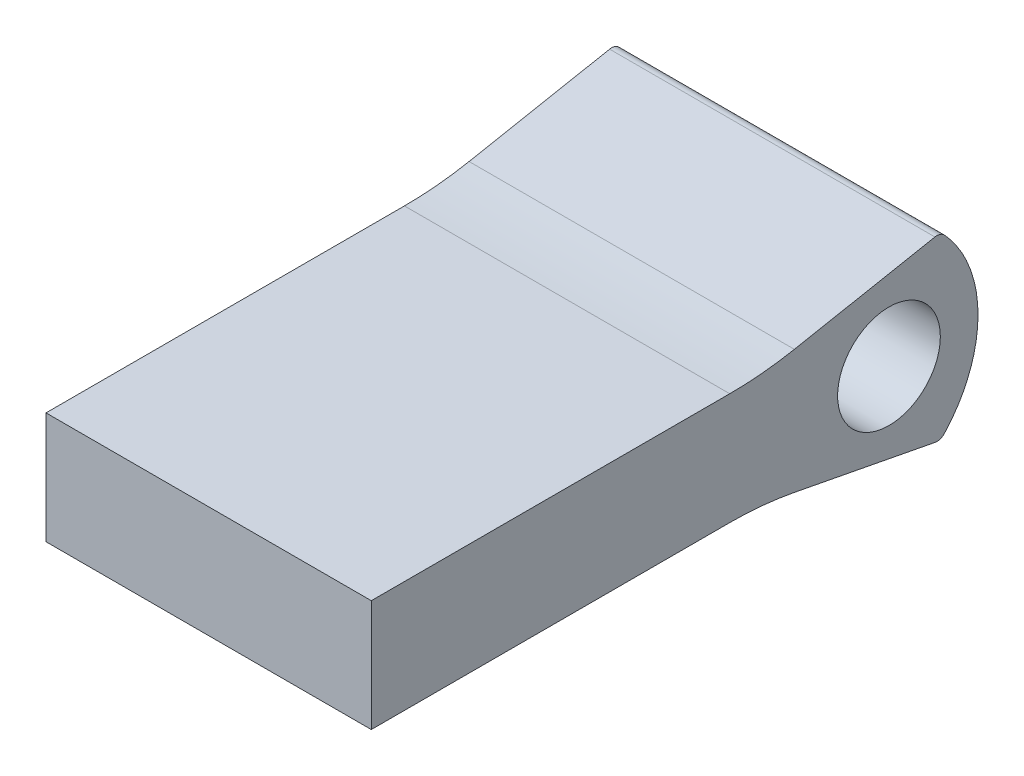
ISO-10303-21;
HEADER;
FILE_DESCRIPTION(('STEP AP214'),'2;1');
FILE_NAME('part.step','',(''),(''),'','','');
FILE_SCHEMA(('AUTOMOTIVE_DESIGN { 1 0 10303 214 1 1 1 1 }'));
ENDSEC;
DATA;
#1=APPLICATION_CONTEXT('core data for automotive mechanical design processes');
#2=APPLICATION_PROTOCOL_DEFINITION('international standard','automotive_design',2000,#1);
#3=PRODUCT_CONTEXT('',#1,'mechanical');
#4=PRODUCT('Part','Part','',(#3));
#5=PRODUCT_RELATED_PRODUCT_CATEGORY('part','',(#4));
#6=PRODUCT_DEFINITION_FORMATION('','',#4);
#7=PRODUCT_DEFINITION_CONTEXT('part definition',#1,'design');
#8=PRODUCT_DEFINITION('design','',#6,#7);
#9=PRODUCT_DEFINITION_SHAPE('','',#8);
#10=(LENGTH_UNIT() NAMED_UNIT(*) SI_UNIT(.MILLI.,.METRE.));
#11=(NAMED_UNIT(*) PLANE_ANGLE_UNIT() SI_UNIT($,.RADIAN.));
#12=(NAMED_UNIT(*) SI_UNIT($,.STERADIAN.) SOLID_ANGLE_UNIT());
#13=UNCERTAINTY_MEASURE_WITH_UNIT(LENGTH_MEASURE(1.E-05),#10,'distance_accuracy_value','');
#14=(GEOMETRIC_REPRESENTATION_CONTEXT(3) GLOBAL_UNCERTAINTY_ASSIGNED_CONTEXT((#13)) GLOBAL_UNIT_ASSIGNED_CONTEXT((#10,
#11,#12)) REPRESENTATION_CONTEXT('',''));
#15=CARTESIAN_POINT('',(0.,0.,0.));
#16=DIRECTION('',(0.,0.,1.));
#17=DIRECTION('',(1.,0.,0.));
#18=AXIS2_PLACEMENT_3D('',#15,#16,#17);
#19=CARTESIAN_POINT('',(-4.75,-1.63,11.42));
#20=DIRECTION('',(1.,0.,0.));
#21=DIRECTION('',(0.,0.,-1.));
#22=AXIS2_PLACEMENT_3D('',#19,#20,#21);
#23=PLANE('',#22);
#24=CARTESIAN_POINT('',(-4.75,0.,-3.69821614915546));
#25=DIRECTION('',(1.,0.,0.));
#26=DIRECTION('',(0.,0.,-1.));
#27=AXIS2_PLACEMENT_3D('',#24,#25,#26);
#28=CIRCLE('',#27,1.5);
#29=CARTESIAN_POINT('',(-4.75,0.,-5.19821614915546));
#30=VERTEX_POINT('',#29);
#31=EDGE_CURVE('E286',#30,#30,#28,.T.);
#32=ORIENTED_EDGE('',*,*,#31,.T.);
#33=EDGE_LOOP('',(#32));
#34=FACE_BOUND('',#33,.T.);
#35=DIRECTION('',(0.,-0.188694042746231,0.982035925122948));
#36=VECTOR('',#35,1.);
#37=CARTESIAN_POINT('',(-4.75,1.5719631299183,0.302046055998579));
#38=LINE('',#37,#36);
#39=CARTESIAN_POINT('',(-4.75,2.59853933788299,-5.04064893015751));
#40=VERTEX_POINT('',#39);
#41=CARTESIAN_POINT('',(-4.75,1.80964074877052,-0.934919122729769));
#42=VERTEX_POINT('',#41);
#43=EDGE_CURVE('E218',#40,#42,#38,.T.);
#44=ORIENTED_EDGE('',*,*,#43,.F.);
#45=CARTESIAN_POINT('',(-4.75,2.3039285603461,-5.09725714298138));
#46=DIRECTION('',(1.,0.,0.));
#47=DIRECTION('',(0.,0.,-1.));
#48=AXIS2_PLACEMENT_3D('',#45,#46,#47);
#49=CIRCLE('',#48,0.3);
#50=CARTESIAN_POINT('',(-4.75,2.5074591827078,-5.31765515967177));
#51=VERTEX_POINT('',#50);
#52=EDGE_CURVE('E176',#40,#51,#49,.F.);
#53=ORIENTED_EDGE('',*,*,#52,.T.);
#54=CARTESIAN_POINT('',(-4.75,-2.62915797088336,-5.2));
#55=CARTESIAN_POINT('',(-4.75,-2.54709102280826,-5.28305208589986));
#56=CARTESIAN_POINT('',(-4.75,-2.45949738312576,-5.36384463459304));
#57=CARTESIAN_POINT('',(-4.75,-2.16436994367198,-5.60978901008948));
#58=CARTESIAN_POINT('',(-4.75,-1.93621131721364,-5.76304208350538));
#59=CARTESIAN_POINT('',(-4.75,-1.43605067362415,-6.01942668348171));
#60=CARTESIAN_POINT('',(-4.75,-1.16408220535042,-6.12235313771278));
#61=CARTESIAN_POINT('',(-4.75,-0.594664263314326,-6.26182489781486));
#62=CARTESIAN_POINT('',(-4.75,-0.297392435895389,-6.29821630623773));
#63=CARTESIAN_POINT('',(-4.75,0.297396340524771,-6.29821599207218));
#64=CARTESIAN_POINT('',(-4.75,0.594668129499886,-6.26182426961327));
#65=CARTESIAN_POINT('',(-4.75,1.16408592419857,-6.12235190798175));
#66=CARTESIAN_POINT('',(-4.75,1.4360542837413,-6.01942516644496));
#67=CARTESIAN_POINT('',(-4.75,1.93621465648745,-5.7630400381023));
#68=CARTESIAN_POINT('',(-4.75,2.1643731210501,-5.60978672366112));
#69=CARTESIAN_POINT('',(-4.75,2.45949926240946,-5.3638429016465));
#70=CARTESIAN_POINT('',(-4.75,2.54709190215545,-5.28305119641047));
#71=CARTESIAN_POINT('',(-4.75,2.62915797088336,-5.2));
#72=B_SPLINE_CURVE_WITH_KNOTS('',3,(#54,#55,#56,#57,#58,#59,#60,#61,#62,#63,#64,#65,#66,#67,#68,
#69,#70,#71),.UNSPECIFIED.,.F.,.F.,(4,2,2,2,2,2,2,2,4),(0.163498387617703,0.204239042081437,
0.292588570034293,0.380938097987149,0.469287625940006,0.557637153892862,0.645986681845718,
0.734336209798575,0.775076410113093),.UNSPECIFIED.);
#73=CARTESIAN_POINT('',(-4.75,-2.50745918260675,-5.31765515940944));
#74=VERTEX_POINT('',#73);
#75=EDGE_CURVE('E146',#51,#74,#72,.F.);
#76=ORIENTED_EDGE('',*,*,#75,.T.);
#77=CARTESIAN_POINT('',(-4.75,-2.30392856028807,-5.09725714267932));
#78=DIRECTION('',(1.,0.,0.));
#79=DIRECTION('',(0.,0.,-1.));
#80=AXIS2_PLACEMENT_3D('',#77,#78,#79);
#81=CIRCLE('',#80,0.3);
#82=CARTESIAN_POINT('',(-4.75,-2.59853933782495,-5.04064892985546));
#83=VERTEX_POINT('',#82);
#84=EDGE_CURVE('E173',#74,#83,#81,.F.);
#85=ORIENTED_EDGE('',*,*,#84,.T.);
#86=DIRECTION('',(0.,0.188694042746231,0.982035925122948));
#87=VECTOR('',#86,1.);
#88=CARTESIAN_POINT('',(-4.75,-1.5719631299183,0.302046055998579));
#89=LINE('',#88,#87);
#90=CARTESIAN_POINT('',(-4.75,-1.80964074877053,-0.93491912272978));
#91=VERTEX_POINT('',#90);
#92=EDGE_CURVE('E224',#83,#91,#89,.T.);
#93=ORIENTED_EDGE('',*,*,#92,.T.);
#94=CARTESIAN_POINT('',(-4.75,-11.63,0.952021304732535));
#95=DIRECTION('',(1.,0.,0.));
#96=DIRECTION('',(0.,0.,-1.));
#97=AXIS2_PLACEMENT_3D('',#94,#95,#96);
#98=CIRCLE('',#97,10.);
#99=CARTESIAN_POINT('',(-4.75,-1.63,0.952021304732535));
#100=VERTEX_POINT('',#99);
#101=EDGE_CURVE('E11',#91,#100,#98,.T.);
#102=ORIENTED_EDGE('',*,*,#101,.T.);
#103=DIRECTION('',(0.,0.,-1.));
#104=VECTOR('',#103,1.);
#105=CARTESIAN_POINT('',(-4.75,-1.63,11.42));
#106=LINE('',#105,#104);
#107=CARTESIAN_POINT('',(-4.75,-1.63,11.42));
#108=VERTEX_POINT('',#107);
#109=EDGE_CURVE('E129',#108,#100,#106,.T.);
#110=ORIENTED_EDGE('',*,*,#109,.F.);
#111=DIRECTION('',(0.,-1.,0.));
#112=VECTOR('',#111,1.);
#113=CARTESIAN_POINT('',(-4.75,-1.63,11.42));
#114=LINE('',#113,#112);
#115=CARTESIAN_POINT('',(-4.75,1.63,11.42));
#116=VERTEX_POINT('',#115);
#117=EDGE_CURVE('E136',#116,#108,#114,.T.);
#118=ORIENTED_EDGE('',*,*,#117,.F.);
#119=DIRECTION('',(0.,0.,-1.));
#120=VECTOR('',#119,1.);
#121=CARTESIAN_POINT('',(-4.75,1.63,11.42));
#122=LINE('',#121,#120);
#123=CARTESIAN_POINT('',(-4.75,1.63,0.952021304732544));
#124=VERTEX_POINT('',#123);
#125=EDGE_CURVE('E215',#116,#124,#122,.T.);
#126=ORIENTED_EDGE('',*,*,#125,.T.);
#127=CARTESIAN_POINT('',(-4.75,11.63,0.952021304732544));
#128=DIRECTION('',(1.,0.,0.));
#129=DIRECTION('',(0.,0.,-1.));
#130=AXIS2_PLACEMENT_3D('',#127,#128,#129);
#131=CIRCLE('',#130,10.);
#132=EDGE_CURVE('E195',#124,#42,#131,.T.);
#133=ORIENTED_EDGE('',*,*,#132,.T.);
#134=EDGE_LOOP('',(#44,#53,#76,#85,#93,#102,#110,#118,#126,#133));
#135=FACE_BOUND('',#134,.T.);
#136=ADVANCED_FACE('F46',(#34,#135),#23,.F.);
#137=CARTESIAN_POINT('',(4.75,-1.63,11.42));
#138=DIRECTION('',(0.,1.,0.));
#139=DIRECTION('',(-1.,0.,0.));
#140=AXIS2_PLACEMENT_3D('',#137,#138,#139);
#141=PLANE('',#140);
#142=ORIENTED_EDGE('',*,*,#109,.T.);
#143=DIRECTION('',(1.,0.,0.));
#144=VECTOR('',#143,1.);
#145=CARTESIAN_POINT('',(4.75000000000001,-1.63,0.95202130473254));
#146=LINE('',#145,#144);
#147=CARTESIAN_POINT('',(4.75,-1.63,0.95202130473254));
#148=VERTEX_POINT('',#147);
#149=EDGE_CURVE('E190',#100,#148,#146,.T.);
#150=ORIENTED_EDGE('',*,*,#149,.T.);
#151=DIRECTION('',(0.,0.,-1.));
#152=VECTOR('',#151,1.);
#153=CARTESIAN_POINT('',(4.75,-1.63,11.42));
#154=LINE('',#153,#152);
#155=CARTESIAN_POINT('',(4.75,-1.63,11.42));
#156=VERTEX_POINT('',#155);
#157=EDGE_CURVE('E131',#156,#148,#154,.T.);
#158=ORIENTED_EDGE('',*,*,#157,.F.);
#159=DIRECTION('',(1.,0.,0.));
#160=VECTOR('',#159,1.);
#161=CARTESIAN_POINT('',(4.75,-1.63,11.42));
#162=LINE('',#161,#160);
#163=EDGE_CURVE('E124',#108,#156,#162,.T.);
#164=ORIENTED_EDGE('',*,*,#163,.F.);
#165=EDGE_LOOP('',(#142,#150,#158,#164));
#166=FACE_BOUND('',#165,.T.);
#167=ADVANCED_FACE('F126',(#166),#141,.F.);
#168=CARTESIAN_POINT('',(4.75,-1.63,11.42));
#169=DIRECTION('',(-1.,0.,0.));
#170=DIRECTION('',(0.,0.,1.));
#171=AXIS2_PLACEMENT_3D('',#168,#169,#170);
#172=PLANE('',#171);
#173=CARTESIAN_POINT('',(4.75,0.,-3.69821614915546));
#174=DIRECTION('',(1.,0.,0.));
#175=DIRECTION('',(0.,0.,-1.));
#176=AXIS2_PLACEMENT_3D('',#173,#174,#175);
#177=CIRCLE('',#176,1.5);
#178=CARTESIAN_POINT('',(4.75,0.,-5.19821614915546));
#179=VERTEX_POINT('',#178);
#180=EDGE_CURVE('E289',#179,#179,#177,.T.);
#181=ORIENTED_EDGE('',*,*,#180,.F.);
#182=EDGE_LOOP('',(#181));
#183=FACE_BOUND('',#182,.T.);
#184=CARTESIAN_POINT('',(4.75,-2.62915797088336,-5.2));
#185=CARTESIAN_POINT('',(4.75,-2.54709102280826,-5.28305208589986));
#186=CARTESIAN_POINT('',(4.75,-2.45949738312576,-5.36384463459304));
#187=CARTESIAN_POINT('',(4.75,-2.16436994367198,-5.60978901008948));
#188=CARTESIAN_POINT('',(4.75,-1.93621131721364,-5.76304208350538));
#189=CARTESIAN_POINT('',(4.75,-1.43605067362415,-6.01942668348171));
#190=CARTESIAN_POINT('',(4.75,-1.16408220535042,-6.12235313771278));
#191=CARTESIAN_POINT('',(4.75,-0.594664263314326,-6.26182489781486));
#192=CARTESIAN_POINT('',(4.75,-0.297392435895389,-6.29821630623773));
#193=CARTESIAN_POINT('',(4.75,0.297396340524771,-6.29821599207218));
#194=CARTESIAN_POINT('',(4.75,0.594668129499886,-6.26182426961327));
#195=CARTESIAN_POINT('',(4.75,1.16408592419857,-6.12235190798175));
#196=CARTESIAN_POINT('',(4.75,1.4360542837413,-6.01942516644496));
#197=CARTESIAN_POINT('',(4.75,1.93621465648745,-5.7630400381023));
#198=CARTESIAN_POINT('',(4.75,2.1643731210501,-5.60978672366112));
#199=CARTESIAN_POINT('',(4.75,2.45949926240946,-5.3638429016465));
#200=CARTESIAN_POINT('',(4.75,2.54709190215545,-5.28305119641047));
#201=CARTESIAN_POINT('',(4.75,2.62915797088336,-5.2));
#202=B_SPLINE_CURVE_WITH_KNOTS('',3,(#184,#185,#186,#187,#188,#189,#190,#191,#192,#193,#194,
#195,#196,#197,#198,#199,#200,#201),.UNSPECIFIED.,.F.,.F.,(4,2,2,2,2,2,2,2,4),
(0.163498387617703,0.204239042081437,0.292588570034293,0.380938097987149,0.469287625940006,
0.557637153892862,0.645986681845718,0.734336209798575,0.775076410113093),.UNSPECIFIED.);
#203=CARTESIAN_POINT('',(4.75,2.5074591827078,-5.31765515967177));
#204=VERTEX_POINT('',#203);
#205=CARTESIAN_POINT('',(4.75,-2.50745918260675,-5.31765515940944));
#206=VERTEX_POINT('',#205);
#207=EDGE_CURVE('E230',#204,#206,#202,.F.);
#208=ORIENTED_EDGE('',*,*,#207,.F.);
#209=CARTESIAN_POINT('',(4.75,2.3039285603461,-5.09725714298138));
#210=DIRECTION('',(-1.,0.,0.));
#211=DIRECTION('',(0.,0.,1.));
#212=AXIS2_PLACEMENT_3D('',#209,#210,#211);
#213=CIRCLE('',#212,0.3);
#214=CARTESIAN_POINT('',(4.75,2.59853933788299,-5.04064893015751));
#215=VERTEX_POINT('',#214);
#216=EDGE_CURVE('E167',#204,#215,#213,.F.);
#217=ORIENTED_EDGE('',*,*,#216,.T.);
#218=DIRECTION('',(0.,-0.188694042746231,0.982035925122948));
#219=VECTOR('',#218,1.);
#220=CARTESIAN_POINT('',(4.75,1.5719631299183,0.302046055998579));
#221=LINE('',#220,#219);
#222=CARTESIAN_POINT('',(4.75,1.80964074877052,-0.934919122729774));
#223=VERTEX_POINT('',#222);
#224=EDGE_CURVE('E208',#215,#223,#221,.T.);
#225=ORIENTED_EDGE('',*,*,#224,.T.);
#226=CARTESIAN_POINT('',(4.75,11.63,0.952021304732539));
#227=DIRECTION('',(-1.,0.,0.));
#228=DIRECTION('',(0.,0.,1.));
#229=AXIS2_PLACEMENT_3D('',#226,#227,#228);
#230=CIRCLE('',#229,10.);
#231=CARTESIAN_POINT('',(4.75,1.63,0.952021304732539));
#232=VERTEX_POINT('',#231);
#233=EDGE_CURVE('E198',#223,#232,#230,.T.);
#234=ORIENTED_EDGE('',*,*,#233,.T.);
#235=DIRECTION('',(0.,0.,-1.));
#236=VECTOR('',#235,1.);
#237=CARTESIAN_POINT('',(4.75,1.63,11.42));
#238=LINE('',#237,#236);
#239=CARTESIAN_POINT('',(4.75,1.63,11.42));
#240=VERTEX_POINT('',#239);
#241=EDGE_CURVE('E157',#240,#232,#238,.T.);
#242=ORIENTED_EDGE('',*,*,#241,.F.);
#243=DIRECTION('',(0.,1.,0.));
#244=VECTOR('',#243,1.);
#245=CARTESIAN_POINT('',(4.75,-1.63,11.42));
#246=LINE('',#245,#244);
#247=EDGE_CURVE('E135',#156,#240,#246,.T.);
#248=ORIENTED_EDGE('',*,*,#247,.F.);
#249=ORIENTED_EDGE('',*,*,#157,.T.);
#250=CARTESIAN_POINT('',(4.75,-11.63,0.95202130473254));
#251=DIRECTION('',(-1.,0.,0.));
#252=DIRECTION('',(0.,0.,1.));
#253=AXIS2_PLACEMENT_3D('',#250,#251,#252);
#254=CIRCLE('',#253,10.);
#255=CARTESIAN_POINT('',(4.75,-1.80964074877052,-0.934919122729774));
#256=VERTEX_POINT('',#255);
#257=EDGE_CURVE('E55',#148,#256,#254,.T.);
#258=ORIENTED_EDGE('',*,*,#257,.T.);
#259=DIRECTION('',(0.,0.188694042746231,0.982035925122948));
#260=VECTOR('',#259,1.);
#261=CARTESIAN_POINT('',(4.75,-1.5719631299183,0.302046055998579));
#262=LINE('',#261,#260);
#263=CARTESIAN_POINT('',(4.75,-2.59853933782495,-5.04064892985545));
#264=VERTEX_POINT('',#263);
#265=EDGE_CURVE('E225',#264,#256,#262,.T.);
#266=ORIENTED_EDGE('',*,*,#265,.F.);
#267=CARTESIAN_POINT('',(4.75,-2.30392856028807,-5.09725714267932));
#268=DIRECTION('',(-1.,0.,0.));
#269=DIRECTION('',(0.,0.,1.));
#270=AXIS2_PLACEMENT_3D('',#267,#268,#269);
#271=CIRCLE('',#270,0.3);
#272=EDGE_CURVE('E164',#264,#206,#271,.F.);
#273=ORIENTED_EDGE('',*,*,#272,.T.);
#274=EDGE_LOOP('',(#208,#217,#225,#234,#242,#248,#249,#258,#266,#273));
#275=FACE_BOUND('',#274,.T.);
#276=ADVANCED_FACE('F206',(#183,#275),#172,.F.);
#277=CARTESIAN_POINT('',(4.75,1.63,11.42));
#278=DIRECTION('',(0.,-1.,0.));
#279=DIRECTION('',(1.,0.,0.));
#280=AXIS2_PLACEMENT_3D('',#277,#278,#279);
#281=PLANE('',#280);
#282=ORIENTED_EDGE('',*,*,#241,.T.);
#283=DIRECTION('',(-1.,0.,0.));
#284=VECTOR('',#283,1.);
#285=CARTESIAN_POINT('',(-4.75,1.63,0.952021304732544));
#286=LINE('',#285,#284);
#287=EDGE_CURVE('E183',#232,#124,#286,.T.);
#288=ORIENTED_EDGE('',*,*,#287,.T.);
#289=ORIENTED_EDGE('',*,*,#125,.F.);
#290=DIRECTION('',(-1.,0.,0.));
#291=VECTOR('',#290,1.);
#292=CARTESIAN_POINT('',(4.75,1.63,11.42));
#293=LINE('',#292,#291);
#294=EDGE_CURVE('E141',#240,#116,#293,.T.);
#295=ORIENTED_EDGE('',*,*,#294,.F.);
#296=EDGE_LOOP('',(#282,#288,#289,#295));
#297=FACE_BOUND('',#296,.T.);
#298=ADVANCED_FACE('F213',(#297),#281,.F.);
#299=CARTESIAN_POINT('',(0.,0.,11.42));
#300=DIRECTION('',(0.,0.,1.));
#301=DIRECTION('',(1.,0.,0.));
#302=AXIS2_PLACEMENT_3D('',#299,#300,#301);
#303=PLANE('',#302);
#304=ORIENTED_EDGE('',*,*,#117,.T.);
#305=ORIENTED_EDGE('',*,*,#163,.T.);
#306=ORIENTED_EDGE('',*,*,#247,.T.);
#307=ORIENTED_EDGE('',*,*,#294,.T.);
#308=EDGE_LOOP('',(#304,#305,#306,#307));
#309=FACE_BOUND('',#308,.T.);
#310=ADVANCED_FACE('F139',(#309),#303,.T.);
#311=CARTESIAN_POINT('',(-12.9547190801146,-1.5719631299183,0.302046055998579));
#312=DIRECTION('',(0.,-0.982035925122947,0.188694042746231));
#313=DIRECTION('',(0.,-0.188694042746231,-0.982035925122948));
#314=AXIS2_PLACEMENT_3D('',#311,#312,#313);
#315=PLANE('',#314);
#316=ORIENTED_EDGE('',*,*,#265,.T.);
#317=DIRECTION('',(1.,0.,0.));
#318=VECTOR('',#317,1.);
#319=CARTESIAN_POINT('',(-12.9547190801146,-1.80964074877053,-0.934919122729785));
#320=LINE('',#319,#318);
#321=EDGE_CURVE('E68',#256,#91,#320,.F.);
#322=ORIENTED_EDGE('',*,*,#321,.T.);
#323=ORIENTED_EDGE('',*,*,#92,.F.);
#324=DIRECTION('',(1.,0.,0.));
#325=VECTOR('',#324,1.);
#326=CARTESIAN_POINT('',(-12.9547190801146,-2.59853933782495,-5.04064892985545));
#327=LINE('',#326,#325);
#328=EDGE_CURVE('E179',#83,#264,#327,.T.);
#329=ORIENTED_EDGE('',*,*,#328,.T.);
#330=EDGE_LOOP('',(#316,#322,#323,#329));
#331=FACE_BOUND('',#330,.T.);
#332=ADVANCED_FACE('F251',(#331),#315,.T.);
#333=CARTESIAN_POINT('',(-12.9547190801146,1.5719631299183,0.302046055998579));
#334=DIRECTION('',(0.,-0.982035925122947,-0.188694042746231));
#335=DIRECTION('',(0.,0.188694042746231,-0.982035925122948));
#336=AXIS2_PLACEMENT_3D('',#333,#334,#335);
#337=PLANE('',#336);
#338=ORIENTED_EDGE('',*,*,#43,.T.);
#339=DIRECTION('',(-1.,0.,0.));
#340=VECTOR('',#339,1.);
#341=CARTESIAN_POINT('',(4.75,1.80964074877052,-0.934919122729774));
#342=LINE('',#341,#340);
#343=EDGE_CURVE('E187',#42,#223,#342,.F.);
#344=ORIENTED_EDGE('',*,*,#343,.T.);
#345=ORIENTED_EDGE('',*,*,#224,.F.);
#346=DIRECTION('',(-1.,0.,0.));
#347=VECTOR('',#346,1.);
#348=CARTESIAN_POINT('',(-4.75,2.59853933788299,-5.04064893015751));
#349=LINE('',#348,#347);
#350=EDGE_CURVE('E170',#215,#40,#349,.T.);
#351=ORIENTED_EDGE('',*,*,#350,.T.);
#352=EDGE_LOOP('',(#338,#344,#345,#351));
#353=FACE_BOUND('',#352,.T.);
#354=ADVANCED_FACE('F221',(#353),#337,.F.);
#355=CARTESIAN_POINT('',(-12.9547190801146,-2.62915797088336,-5.2));
#356=CARTESIAN_POINT('',(-12.9547190801146,-2.54709102280826,-5.28305208589986));
#357=CARTESIAN_POINT('',(-12.9547190801146,-2.45949738312576,-5.36384463459304));
#358=CARTESIAN_POINT('',(-12.9547190801146,-2.16436994367198,-5.60978901008948));
#359=CARTESIAN_POINT('',(-12.9547190801146,-1.93621131721364,-5.76304208350538));
#360=CARTESIAN_POINT('',(-12.9547190801146,-1.43605067362415,-6.01942668348171));
#361=CARTESIAN_POINT('',(-12.9547190801146,-1.16408220535042,-6.12235313771278));
#362=CARTESIAN_POINT('',(-12.9547190801146,-0.594664263314326,-6.26182489781486));
#363=CARTESIAN_POINT('',(-12.9547190801146,-0.297392435895389,-6.29821630623773));
#364=CARTESIAN_POINT('',(-12.9547190801146,0.297396340524771,-6.29821599207218));
#365=CARTESIAN_POINT('',(-12.9547190801146,0.594668129499886,-6.26182426961327));
#366=CARTESIAN_POINT('',(-12.9547190801146,1.16408592419857,-6.12235190798175));
#367=CARTESIAN_POINT('',(-12.9547190801146,1.4360542837413,-6.01942516644496));
#368=CARTESIAN_POINT('',(-12.9547190801146,1.93621465648745,-5.7630400381023));
#369=CARTESIAN_POINT('',(-12.9547190801146,2.1643731210501,-5.60978672366112));
#370=CARTESIAN_POINT('',(-12.9547190801146,2.45949926240946,-5.3638429016465));
#371=CARTESIAN_POINT('',(-12.9547190801146,2.54709190215545,-5.28305119641047));
#372=CARTESIAN_POINT('',(-12.9547190801146,2.62915797088336,-5.2));
#373=B_SPLINE_CURVE_WITH_KNOTS('',3,(#355,#356,#357,#358,#359,#360,#361,#362,#363,#364,#365,
#366,#367,#368,#369,#370,#371,#372),.UNSPECIFIED.,.F.,.F.,(4,2,2,2,2,2,2,2,4),
(0.163498387617703,0.204239042081437,0.292588570034293,0.380938097987149,0.469287625940006,
0.557637153892862,0.645986681845718,0.734336209798575,0.775076410113093),.UNSPECIFIED.);
#374=DIRECTION('',(1.,0.,0.));
#375=VECTOR('',#374,1.);
#376=SURFACE_OF_LINEAR_EXTRUSION('',#373,#375);
#377=ORIENTED_EDGE('',*,*,#75,.F.);
#378=DIRECTION('',(1.,0.,0.));
#379=VECTOR('',#378,1.);
#380=CARTESIAN_POINT('',(-4.75,2.50745918270965,-5.31765515967007));
#381=LINE('',#380,#379);
#382=EDGE_CURVE('E155',#51,#204,#381,.T.);
#383=ORIENTED_EDGE('',*,*,#382,.T.);
#384=ORIENTED_EDGE('',*,*,#207,.T.);
#385=DIRECTION('',(1.,0.,0.));
#386=VECTOR('',#385,1.);
#387=CARTESIAN_POINT('',(4.75,-2.5074591826086,-5.31765515940774));
#388=LINE('',#387,#386);
#389=EDGE_CURVE('E151',#206,#74,#388,.F.);
#390=ORIENTED_EDGE('',*,*,#389,.T.);
#391=EDGE_LOOP('',(#377,#383,#384,#390));
#392=FACE_BOUND('',#391,.T.);
#393=ADVANCED_FACE('F244',(#392),#376,.T.);
#394=CARTESIAN_POINT('',(0.,2.3039285603461,-5.09725714298138));
#395=DIRECTION('',(1.,0.,0.));
#396=DIRECTION('',(0.,0.,-1.));
#397=AXIS2_PLACEMENT_3D('',#394,#395,#396);
#398=CYLINDRICAL_SURFACE('',#397,0.3);
#399=ORIENTED_EDGE('',*,*,#52,.F.);
#400=ORIENTED_EDGE('',*,*,#350,.F.);
#401=ORIENTED_EDGE('',*,*,#216,.F.);
#402=ORIENTED_EDGE('',*,*,#382,.F.);
#403=EDGE_LOOP('',(#399,#400,#401,#402));
#404=FACE_BOUND('',#403,.T.);
#405=ADVANCED_FACE('F248',(#404),#398,.T.);
#406=CARTESIAN_POINT('',(0.,-2.30392856028807,-5.09725714267932));
#407=DIRECTION('',(1.,0.,0.));
#408=DIRECTION('',(0.,0.,-1.));
#409=AXIS2_PLACEMENT_3D('',#406,#407,#408);
#410=CYLINDRICAL_SURFACE('',#409,0.3);
#411=ORIENTED_EDGE('',*,*,#84,.F.);
#412=ORIENTED_EDGE('',*,*,#389,.F.);
#413=ORIENTED_EDGE('',*,*,#272,.F.);
#414=ORIENTED_EDGE('',*,*,#328,.F.);
#415=EDGE_LOOP('',(#411,#412,#413,#414));
#416=FACE_BOUND('',#415,.T.);
#417=ADVANCED_FACE('F268',(#416),#410,.T.);
#418=CARTESIAN_POINT('',(-4.75,0.,-3.69821614915546));
#419=DIRECTION('',(1.,0.,0.));
#420=DIRECTION('',(0.,0.,-1.));
#421=AXIS2_PLACEMENT_3D('',#418,#419,#420);
#422=CYLINDRICAL_SURFACE('',#421,1.5);
#423=ORIENTED_EDGE('',*,*,#31,.F.);
#424=EDGE_LOOP('',(#423));
#425=FACE_BOUND('',#424,.T.);
#426=ORIENTED_EDGE('',*,*,#180,.T.);
#427=EDGE_LOOP('',(#426));
#428=FACE_BOUND('',#427,.T.);
#429=ADVANCED_FACE('F271',(#425,#428),#422,.F.);
#430=CARTESIAN_POINT('',(4.74999999999999,11.63,0.952021304732539));
#431=DIRECTION('',(1.,0.,0.));
#432=DIRECTION('',(0.,0.,-1.));
#433=AXIS2_PLACEMENT_3D('',#430,#431,#432);
#434=CYLINDRICAL_SURFACE('',#433,10.);
#435=ORIENTED_EDGE('',*,*,#233,.F.);
#436=ORIENTED_EDGE('',*,*,#343,.F.);
#437=ORIENTED_EDGE('',*,*,#132,.F.);
#438=ORIENTED_EDGE('',*,*,#287,.F.);
#439=EDGE_LOOP('',(#435,#436,#437,#438));
#440=FACE_BOUND('',#439,.T.);
#441=ADVANCED_FACE('F216',(#440),#434,.F.);
#442=CARTESIAN_POINT('',(4.75000000000001,-11.63,0.95202130473254));
#443=DIRECTION('',(1.,0.,0.));
#444=DIRECTION('',(0.,0.,-1.));
#445=AXIS2_PLACEMENT_3D('',#442,#443,#444);
#446=CYLINDRICAL_SURFACE('',#445,10.);
#447=ORIENTED_EDGE('',*,*,#101,.F.);
#448=ORIENTED_EDGE('',*,*,#321,.F.);
#449=ORIENTED_EDGE('',*,*,#257,.F.);
#450=ORIENTED_EDGE('',*,*,#149,.F.);
#451=EDGE_LOOP('',(#447,#448,#449,#450));
#452=FACE_BOUND('',#451,.T.);
#453=ADVANCED_FACE('F48',(#452),#446,.F.);
#454=CLOSED_SHELL('',(#136,#167,#276,#298,#310,#332,#354,#393,#405,#417,#429,#441,#453));
#455=MANIFOLD_SOLID_BREP('B2',#454);
#456=ADVANCED_BREP_SHAPE_REPRESENTATION('',(#18,#455),#14);
#457=SHAPE_DEFINITION_REPRESENTATION(#9,#456);
ENDSEC;
END-ISO-10303-21;
